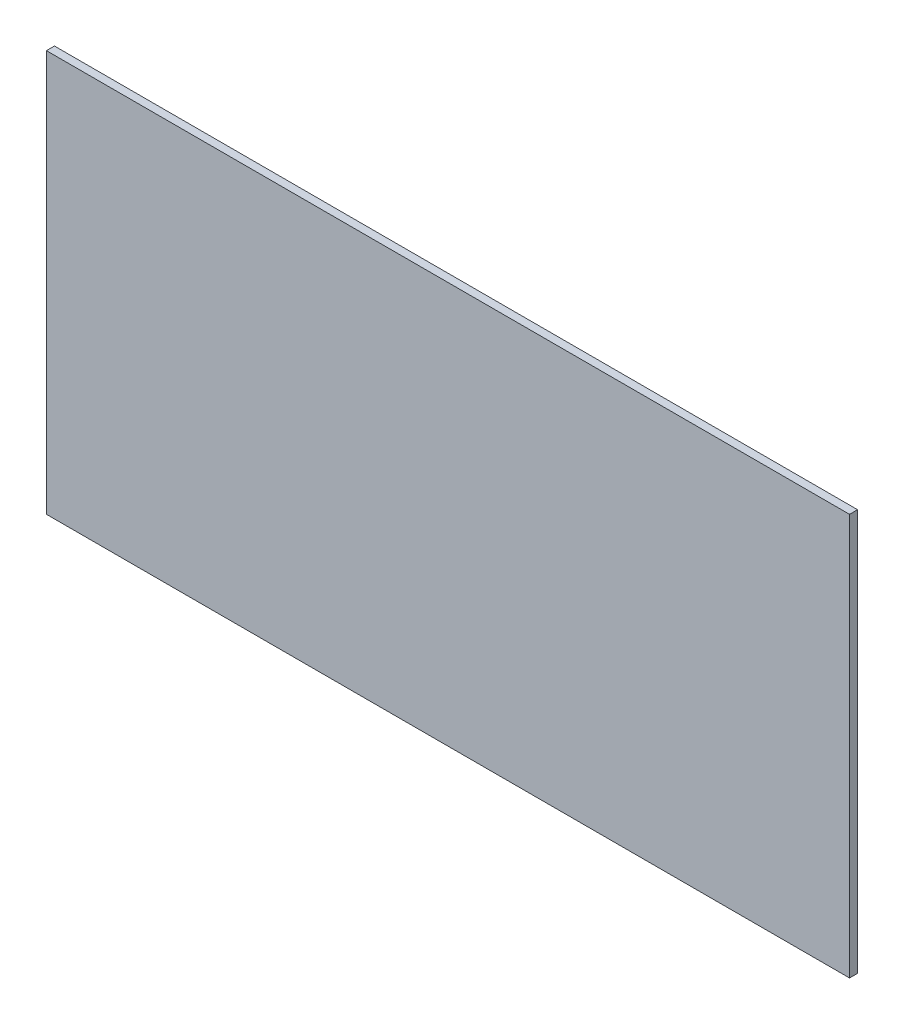
ISO-10303-21;
HEADER;
FILE_DESCRIPTION(('STEP AP214'),'2;1');
FILE_NAME('part.step','',(''),(''),'','','');
FILE_SCHEMA(('AUTOMOTIVE_DESIGN { 1 0 10303 214 1 1 1 1 }'));
ENDSEC;
DATA;
#1=APPLICATION_CONTEXT('core data for automotive mechanical design processes');
#2=APPLICATION_PROTOCOL_DEFINITION('international standard','automotive_design',2000,#1);
#3=PRODUCT_CONTEXT('',#1,'mechanical');
#4=PRODUCT('Part','Part','',(#3));
#5=PRODUCT_RELATED_PRODUCT_CATEGORY('part','',(#4));
#6=PRODUCT_DEFINITION_FORMATION('','',#4);
#7=PRODUCT_DEFINITION_CONTEXT('part definition',#1,'design');
#8=PRODUCT_DEFINITION('design','',#6,#7);
#9=PRODUCT_DEFINITION_SHAPE('','',#8);
#10=(LENGTH_UNIT() NAMED_UNIT(*) SI_UNIT(.MILLI.,.METRE.));
#11=(NAMED_UNIT(*) PLANE_ANGLE_UNIT() SI_UNIT($,.RADIAN.));
#12=(NAMED_UNIT(*) SI_UNIT($,.STERADIAN.) SOLID_ANGLE_UNIT());
#13=UNCERTAINTY_MEASURE_WITH_UNIT(LENGTH_MEASURE(1.E-05),#10,'distance_accuracy_value','');
#14=(GEOMETRIC_REPRESENTATION_CONTEXT(3) GLOBAL_UNCERTAINTY_ASSIGNED_CONTEXT((#13)) GLOBAL_UNIT_ASSIGNED_CONTEXT((#10,
#11,#12)) REPRESENTATION_CONTEXT('',''));
#15=CARTESIAN_POINT('',(0.,0.,0.));
#16=DIRECTION('',(0.,0.,1.));
#17=DIRECTION('',(1.,0.,0.));
#18=AXIS2_PLACEMENT_3D('',#15,#16,#17);
#19=CARTESIAN_POINT('',(1000.,500.,20.));
#20=DIRECTION('',(-1.,0.,0.));
#21=DIRECTION('',(0.,-1.,0.));
#22=AXIS2_PLACEMENT_3D('',#19,#20,#21);
#23=PLANE('',#22);
#24=DIRECTION('',(0.,1.,0.));
#25=VECTOR('',#24,1.);
#26=CARTESIAN_POINT('',(1000.,500.,0.));
#27=LINE('',#26,#25);
#28=CARTESIAN_POINT('',(1000.,-500.,0.));
#29=VERTEX_POINT('',#28);
#30=CARTESIAN_POINT('',(1000.,500.,0.));
#31=VERTEX_POINT('',#30);
#32=EDGE_CURVE('E102',#29,#31,#27,.T.);
#33=ORIENTED_EDGE('',*,*,#32,.T.);
#34=DIRECTION('',(0.,0.,-1.));
#35=VECTOR('',#34,1.);
#36=CARTESIAN_POINT('',(1000.,500.,20.));
#37=LINE('',#36,#35);
#38=CARTESIAN_POINT('',(1000.,500.,20.));
#39=VERTEX_POINT('',#38);
#40=EDGE_CURVE('E11',#39,#31,#37,.T.);
#41=ORIENTED_EDGE('',*,*,#40,.F.);
#42=DIRECTION('',(0.,1.,0.));
#43=VECTOR('',#42,1.);
#44=CARTESIAN_POINT('',(1000.,500.,20.));
#45=LINE('',#44,#43);
#46=CARTESIAN_POINT('',(1000.,-500.,20.));
#47=VERTEX_POINT('',#46);
#48=EDGE_CURVE('E90',#47,#39,#45,.T.);
#49=ORIENTED_EDGE('',*,*,#48,.F.);
#50=DIRECTION('',(0.,0.,-1.));
#51=VECTOR('',#50,1.);
#52=CARTESIAN_POINT('',(1000.,-500.,20.));
#53=LINE('',#52,#51);
#54=EDGE_CURVE('E98',#47,#29,#53,.T.);
#55=ORIENTED_EDGE('',*,*,#54,.T.);
#56=EDGE_LOOP('',(#33,#41,#49,#55));
#57=FACE_BOUND('',#56,.T.);
#58=ADVANCED_FACE('F39',(#57),#23,.F.);
#59=CARTESIAN_POINT('',(-1000.,500.,20.));
#60=DIRECTION('',(0.,-1.,0.));
#61=DIRECTION('',(0.,0.,-1.));
#62=AXIS2_PLACEMENT_3D('',#59,#60,#61);
#63=PLANE('',#62);
#64=DIRECTION('',(-1.,0.,0.));
#65=VECTOR('',#64,1.);
#66=CARTESIAN_POINT('',(-1000.,500.,0.));
#67=LINE('',#66,#65);
#68=CARTESIAN_POINT('',(-1000.,500.,0.));
#69=VERTEX_POINT('',#68);
#70=EDGE_CURVE('E94',#31,#69,#67,.T.);
#71=ORIENTED_EDGE('',*,*,#70,.T.);
#72=DIRECTION('',(0.,0.,-1.));
#73=VECTOR('',#72,1.);
#74=CARTESIAN_POINT('',(-1000.,500.,20.));
#75=LINE('',#74,#73);
#76=CARTESIAN_POINT('',(-1000.,500.,20.));
#77=VERTEX_POINT('',#76);
#78=EDGE_CURVE('E47',#77,#69,#75,.T.);
#79=ORIENTED_EDGE('',*,*,#78,.F.);
#80=DIRECTION('',(-1.,0.,0.));
#81=VECTOR('',#80,1.);
#82=CARTESIAN_POINT('',(-1000.,500.,20.));
#83=LINE('',#82,#81);
#84=EDGE_CURVE('E85',#39,#77,#83,.T.);
#85=ORIENTED_EDGE('',*,*,#84,.F.);
#86=ORIENTED_EDGE('',*,*,#40,.T.);
#87=EDGE_LOOP('',(#71,#79,#85,#86));
#88=FACE_BOUND('',#87,.T.);
#89=ADVANCED_FACE('F93',(#88),#63,.F.);
#90=CARTESIAN_POINT('',(-1000.,500.,20.));
#91=DIRECTION('',(1.,0.,0.));
#92=DIRECTION('',(0.,1.,0.));
#93=AXIS2_PLACEMENT_3D('',#90,#91,#92);
#94=PLANE('',#93);
#95=DIRECTION('',(0.,-1.,0.));
#96=VECTOR('',#95,1.);
#97=CARTESIAN_POINT('',(-1000.,500.,0.));
#98=LINE('',#97,#96);
#99=CARTESIAN_POINT('',(-1000.,-500.,0.));
#100=VERTEX_POINT('',#99);
#101=EDGE_CURVE('E72',#69,#100,#98,.T.);
#102=ORIENTED_EDGE('',*,*,#101,.T.);
#103=DIRECTION('',(0.,0.,-1.));
#104=VECTOR('',#103,1.);
#105=CARTESIAN_POINT('',(-1000.,-500.,20.));
#106=LINE('',#105,#104);
#107=CARTESIAN_POINT('',(-1000.,-500.,20.));
#108=VERTEX_POINT('',#107);
#109=EDGE_CURVE('E95',#108,#100,#106,.T.);
#110=ORIENTED_EDGE('',*,*,#109,.F.);
#111=DIRECTION('',(0.,-1.,0.));
#112=VECTOR('',#111,1.);
#113=CARTESIAN_POINT('',(-1000.,500.,20.));
#114=LINE('',#113,#112);
#115=EDGE_CURVE('E88',#77,#108,#114,.T.);
#116=ORIENTED_EDGE('',*,*,#115,.F.);
#117=ORIENTED_EDGE('',*,*,#78,.T.);
#118=EDGE_LOOP('',(#102,#110,#116,#117));
#119=FACE_BOUND('',#118,.T.);
#120=ADVANCED_FACE('F96',(#119),#94,.F.);
#121=CARTESIAN_POINT('',(-1000.,-500.,20.));
#122=DIRECTION('',(0.,1.,0.));
#123=DIRECTION('',(0.,0.,1.));
#124=AXIS2_PLACEMENT_3D('',#121,#122,#123);
#125=PLANE('',#124);
#126=DIRECTION('',(1.,0.,0.));
#127=VECTOR('',#126,1.);
#128=CARTESIAN_POINT('',(-1000.,-500.,0.));
#129=LINE('',#128,#127);
#130=EDGE_CURVE('E78',#100,#29,#129,.T.);
#131=ORIENTED_EDGE('',*,*,#130,.T.);
#132=ORIENTED_EDGE('',*,*,#54,.F.);
#133=DIRECTION('',(1.,0.,0.));
#134=VECTOR('',#133,1.);
#135=CARTESIAN_POINT('',(-1000.,-500.,20.));
#136=LINE('',#135,#134);
#137=EDGE_CURVE('E55',#108,#47,#136,.T.);
#138=ORIENTED_EDGE('',*,*,#137,.F.);
#139=ORIENTED_EDGE('',*,*,#109,.T.);
#140=EDGE_LOOP('',(#131,#132,#138,#139));
#141=FACE_BOUND('',#140,.T.);
#142=ADVANCED_FACE('F109',(#141),#125,.F.);
#143=CARTESIAN_POINT('',(0.,0.,20.));
#144=DIRECTION('',(0.,0.,1.));
#145=DIRECTION('',(1.,0.,0.));
#146=AXIS2_PLACEMENT_3D('',#143,#144,#145);
#147=PLANE('',#146);
#148=ORIENTED_EDGE('',*,*,#48,.T.);
#149=ORIENTED_EDGE('',*,*,#84,.T.);
#150=ORIENTED_EDGE('',*,*,#115,.T.);
#151=ORIENTED_EDGE('',*,*,#137,.T.);
#152=EDGE_LOOP('',(#148,#149,#150,#151));
#153=FACE_BOUND('',#152,.T.);
#154=ADVANCED_FACE('F86',(#153),#147,.T.);
#155=CARTESIAN_POINT('',(0.,0.,0.));
#156=DIRECTION('',(0.,0.,1.));
#157=DIRECTION('',(1.,0.,0.));
#158=AXIS2_PLACEMENT_3D('',#155,#156,#157);
#159=PLANE('',#158);
#160=ORIENTED_EDGE('',*,*,#32,.F.);
#161=ORIENTED_EDGE('',*,*,#130,.F.);
#162=ORIENTED_EDGE('',*,*,#101,.F.);
#163=ORIENTED_EDGE('',*,*,#70,.F.);
#164=EDGE_LOOP('',(#160,#161,#162,#163));
#165=FACE_BOUND('',#164,.T.);
#166=ADVANCED_FACE('F112',(#165),#159,.F.);
#167=CLOSED_SHELL('',(#58,#89,#120,#142,#154,#166));
#168=MANIFOLD_SOLID_BREP('B2',#167);
#169=ADVANCED_BREP_SHAPE_REPRESENTATION('',(#18,#168),#14);
#170=SHAPE_DEFINITION_REPRESENTATION(#9,#169);
ENDSEC;
END-ISO-10303-21;
